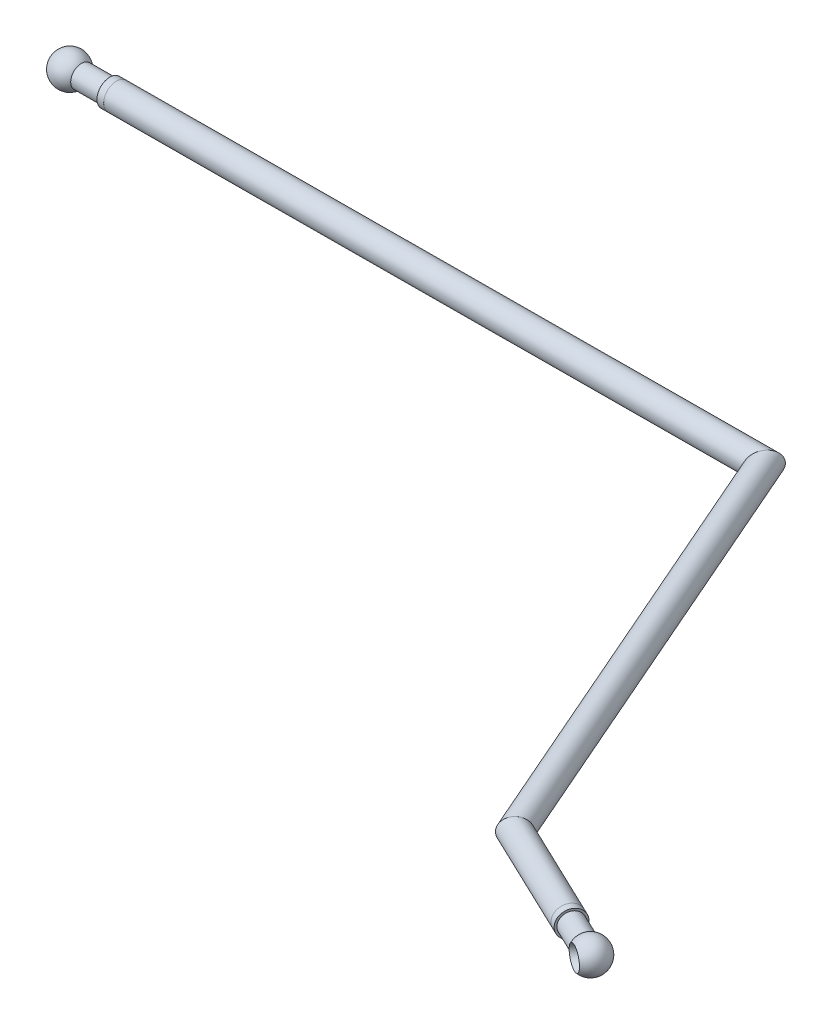
ISO-10303-21;
HEADER;
FILE_DESCRIPTION(('STEP AP214'),'2;1');
FILE_NAME('part.step','',(''),(''),'','','');
FILE_SCHEMA(('AUTOMOTIVE_DESIGN { 1 0 10303 214 1 1 1 1 }'));
ENDSEC;
DATA;
#1=APPLICATION_CONTEXT('core data for automotive mechanical design processes');
#2=APPLICATION_PROTOCOL_DEFINITION('international standard','automotive_design',2000,#1);
#3=PRODUCT_CONTEXT('',#1,'mechanical');
#4=PRODUCT('Part','Part','',(#3));
#5=PRODUCT_RELATED_PRODUCT_CATEGORY('part','',(#4));
#6=PRODUCT_DEFINITION_FORMATION('','',#4);
#7=PRODUCT_DEFINITION_CONTEXT('part definition',#1,'design');
#8=PRODUCT_DEFINITION('design','',#6,#7);
#9=PRODUCT_DEFINITION_SHAPE('','',#8);
#10=(LENGTH_UNIT() NAMED_UNIT(*) SI_UNIT(.MILLI.,.METRE.));
#11=(NAMED_UNIT(*) PLANE_ANGLE_UNIT() SI_UNIT($,.RADIAN.));
#12=(NAMED_UNIT(*) SI_UNIT($,.STERADIAN.) SOLID_ANGLE_UNIT());
#13=UNCERTAINTY_MEASURE_WITH_UNIT(LENGTH_MEASURE(1.E-05),#10,'distance_accuracy_value','');
#14=(GEOMETRIC_REPRESENTATION_CONTEXT(3) GLOBAL_UNCERTAINTY_ASSIGNED_CONTEXT((#13)) GLOBAL_UNIT_ASSIGNED_CONTEXT((#10,
#11,#12)) REPRESENTATION_CONTEXT('',''));
#15=CARTESIAN_POINT('',(0.,0.,0.));
#16=DIRECTION('',(0.,0.,1.));
#17=DIRECTION('',(1.,0.,0.));
#18=AXIS2_PLACEMENT_3D('',#15,#16,#17);
#19=CARTESIAN_POINT('',(739.449138930112,-90.6680158674377,336.150106034467));
#20=DIRECTION('',(-0.897622045646868,-0.0222671955812552,-0.440203174874602));
#21=DIRECTION('',(-0.440312348004288,0.,0.897844661506071));
#22=AXIS2_PLACEMENT_3D('',#19,#20,#21);
#23=CYLINDRICAL_SURFACE('',#22,9.50000000000001);
#24=CARTESIAN_POINT('',(739.449138930112,-90.6680158674377,336.150106034467));
#25=DIRECTION('',(0.897622045646868,0.0222671955812552,0.440203174874602));
#26=DIRECTION('',(-0.024799243118086,0.999692451477338,0.));
#27=AXIS2_PLACEMENT_3D('',#24,#25,#26);
#28=CIRCLE('',#27,9.50000000000001);
#29=CARTESIAN_POINT('',(739.21354612049,-81.170937578403,336.150106034467));
#30=VERTEX_POINT('',#29);
#31=EDGE_CURVE('E69',#30,#30,#28,.T.);
#32=ORIENTED_EDGE('',*,*,#31,.F.);
#33=EDGE_LOOP('',(#32));
#34=FACE_BOUND('',#33,.T.);
#35=CARTESIAN_POINT('',(734.961028701877,-90.779351845344,333.949090160094));
#36=DIRECTION('',(0.897622045646868,0.0222671955812552,0.440203174874602));
#37=DIRECTION('',(-0.024799243118086,0.999692451477338,0.));
#38=AXIS2_PLACEMENT_3D('',#35,#36,#37);
#39=CIRCLE('',#38,9.50000000000001);
#40=CARTESIAN_POINT('',(734.725435892256,-81.2822735563093,333.949090160094));
#41=VERTEX_POINT('',#40);
#42=EDGE_CURVE('E68',#41,#41,#39,.T.);
#43=ORIENTED_EDGE('',*,*,#42,.T.);
#44=EDGE_LOOP('',(#43));
#45=FACE_BOUND('',#44,.T.);
#46=ADVANCED_FACE('F64',(#34,#45),#23,.T.);
#47=CARTESIAN_POINT('',(739.449138930112,-90.6680158674377,336.150106034467));
#48=DIRECTION('',(0.897622045646868,0.0222671955812552,0.440203174874602));
#49=DIRECTION('',(0.440312348004288,0.,-0.897844661506071));
#50=AXIS2_PLACEMENT_3D('',#47,#48,#49);
#51=PLANE('',#50);
#52=CARTESIAN_POINT('',(739.449138930112,-90.6680158674378,336.150106034467));
#53=DIRECTION('',(0.897622045646868,0.0222671955812553,0.440203174874602));
#54=DIRECTION('',(0.440312348004288,0.,-0.897844661506071));
#55=AXIS2_PLACEMENT_3D('',#52,#53,#54);
#56=CIRCLE('',#55,7.99999999999998);
#57=CARTESIAN_POINT('',(742.971637714146,-90.6680158674378,328.967348742418));
#58=VERTEX_POINT('',#57);
#59=EDGE_CURVE('E12',#58,#58,#56,.T.);
#60=ORIENTED_EDGE('',*,*,#59,.F.);
#61=EDGE_LOOP('',(#60));
#62=FACE_BOUND('',#61,.T.);
#63=ORIENTED_EDGE('',*,*,#31,.T.);
#64=EDGE_LOOP('',(#63));
#65=FACE_BOUND('',#64,.T.);
#66=ADVANCED_FACE('F100',(#62,#65),#51,.T.);
#67=CARTESIAN_POINT('',(734.961028701877,-90.779351845344,333.949090160094));
#68=DIRECTION('',(0.897622045646868,0.0222671955812552,0.440203174874602));
#69=DIRECTION('',(0.440312348004288,0.,-0.897844661506071));
#70=AXIS2_PLACEMENT_3D('',#67,#68,#69);
#71=PLANE('',#70);
#72=ORIENTED_EDGE('',*,*,#42,.F.);
#73=EDGE_LOOP('',(#72));
#74=FACE_BOUND('',#73,.T.);
#75=ADVANCED_FACE('F103',(#74),#71,.F.);
#76=CARTESIAN_POINT('',(781.029208390176,-89.6365443885012,356.541403993995));
#77=DIRECTION('',(-0.897622045646868,-0.0222671955812553,-0.440203174874601));
#78=DIRECTION('',(-0.440312348004288,0.,0.897844661506071));
#79=AXIS2_PLACEMENT_3D('',#76,#77,#78);
#80=CYLINDRICAL_SURFACE('',#79,7.99999999999998);
#81=ORIENTED_EDGE('',*,*,#59,.T.);
#82=EDGE_LOOP('',(#81));
#83=FACE_BOUND('',#82,.T.);
#84=CARTESIAN_POINT('',(758.349224650852,-90.1991638519518,345.418904388986));
#85=DIRECTION('',(0.897622045646867,0.0222671955812557,0.440203174874599));
#86=DIRECTION('',(0.440312348004286,0.,-0.897844661506071));
#87=AXIS2_PLACEMENT_3D('',#84,#85,#86);
#88=CIRCLE('',#87,7.99999999999998);
#89=CARTESIAN_POINT('',(761.871723434887,-90.1991638519518,338.236147096938));
#90=VERTEX_POINT('',#89);
#91=EDGE_CURVE('E76',#90,#90,#88,.T.);
#92=ORIENTED_EDGE('',*,*,#91,.F.);
#93=EDGE_LOOP('',(#92));
#94=FACE_BOUND('',#93,.T.);
#95=ADVANCED_FACE('F115',(#83,#94),#80,.T.);
#96=CARTESIAN_POINT('',(766.377800299518,-90.0000000000003,349.356201280705));
#97=DIRECTION('',(0.440312348004288,0.,-0.897844661506071));
#98=DIRECTION('',(0.897844661506071,0.,0.440312348004288));
#99=AXIS2_PLACEMENT_3D('',#96,#97,#98);
#100=SPHERICAL_SURFACE('',#99,11.9999999999917);
#101=CARTESIAN_POINT('',(762.516674572281,-90.0000000000003,357.229455658685));
#102=DIRECTION('',(0.440312348004288,0.,-0.897844661506071));
#103=DIRECTION('',(-0.897844661506071,0.,-0.440312348004288));
#104=AXIS2_PLACEMENT_3D('',#101,#102,#103);
#105=CIRCLE('',#104,8.19167709432452);
#106=CARTESIAN_POINT('',(755.16182102436,-90.0000000000003,353.62255908319));
#107=VERTEX_POINT('',#106);
#108=EDGE_CURVE('E78',#107,#107,#105,.T.);
#109=ORIENTED_EDGE('',*,*,#108,.T.);
#110=EDGE_LOOP('',(#109));
#111=FACE_BOUND('',#110,.T.);
#112=ORIENTED_EDGE('',*,*,#91,.T.);
#113=EDGE_LOOP('',(#112));
#114=FACE_BOUND('',#113,.T.);
#115=ADVANCED_FACE('F92',(#111,#114),#100,.T.);
#116=CARTESIAN_POINT('',(764.938427865156,-90.0000000000003,352.291237879084));
#117=DIRECTION('',(-0.440312348004288,0.,0.897844661506071));
#118=DIRECTION('',(0.897844661506071,0.,0.440312348004288));
#119=AXIS2_PLACEMENT_3D('',#116,#117,#118);
#120=CONICAL_SURFACE('',#119,6.18981156105512,0.349065850398861);
#121=ORIENTED_EDGE('',*,*,#108,.F.);
#122=EDGE_LOOP('',(#121));
#123=FACE_BOUND('',#122,.T.);
#124=CARTESIAN_POINT('',(764.938427865156,-90.0000000000003,352.291237879084));
#125=DIRECTION('',(0.440312348004288,0.,-0.897844661506071));
#126=DIRECTION('',(-0.897844661506071,0.,-0.440312348004288));
#127=AXIS2_PLACEMENT_3D('',#124,#125,#126);
#128=CIRCLE('',#127,6.18981156105509);
#129=CARTESIAN_POINT('',(759.380938599334,-90.0000000000003,349.565787416931));
#130=VERTEX_POINT('',#129);
#131=EDGE_CURVE('E85',#130,#130,#128,.T.);
#132=ORIENTED_EDGE('',*,*,#131,.T.);
#133=EDGE_LOOP('',(#132));
#134=FACE_BOUND('',#133,.T.);
#135=ADVANCED_FACE('F87',(#123,#134),#120,.F.);
#136=CARTESIAN_POINT('',(766.377800299518,-90.0000000000003,349.356201280705));
#137=DIRECTION('',(0.440312348004288,0.,-0.897844661506071));
#138=DIRECTION('',(0.897844661506071,0.,0.440312348004288));
#139=AXIS2_PLACEMENT_3D('',#136,#137,#138);
#140=SPHERICAL_SURFACE('',#139,6.99999999999983);
#141=ORIENTED_EDGE('',*,*,#131,.F.);
#142=EDGE_LOOP('',(#141));
#143=FACE_BOUND('',#142,.T.);
#144=ADVANCED_FACE('F89',(#143),#140,.F.);
#145=CLOSED_SHELL('',(#46,#66,#75,#95,#115,#135,#144));
#146=MANIFOLD_SOLID_BREP('B2',#145);
#147=CARTESIAN_POINT('',(0.461014548223053,-109.,-37.9972033916488));
#148=DIRECTION('',(-0.0194973858732927,0.,0.999809907904552));
#149=DIRECTION('',(0.999809907904552,0.,0.0194973858732927));
#150=AXIS2_PLACEMENT_3D('',#147,#148,#149);
#151=SPHERICAL_SURFACE('',#150,11.9999999999998);
#152=CARTESIAN_POINT('',(0.631975387267541,-109.,-46.7639345755706));
#153=DIRECTION('',(-0.0194973858732927,0.,0.999809907904552));
#154=DIRECTION('',(0.999809907904552,0.,0.0194973858732927));
#155=AXIS2_PLACEMENT_3D('',#152,#153,#154);
#156=CIRCLE('',#155,8.19238651067936);
#157=CARTESIAN_POINT('',(8.82280459002836,-109.,-46.6042044545488));
#158=VERTEX_POINT('',#157);
#159=EDGE_CURVE('E179',#158,#158,#156,.T.);
#160=ORIENTED_EDGE('',*,*,#159,.T.);
#161=EDGE_LOOP('',(#160));
#162=FACE_BOUND('',#161,.T.);
#163=CARTESIAN_POINT('',(9.40083699315448,-108.778230965017,-37.8228670838472));
#164=DIRECTION('',(-0.999502534682283,-0.0247945318763777,-0.0194913917595375));
#165=DIRECTION('',(0.0247992431180859,-0.999692451477338,0.));
#166=AXIS2_PLACEMENT_3D('',#163,#164,#165);
#167=CIRCLE('',#166,8.);
#168=CARTESIAN_POINT('',(9.59923093809916,-116.775770576835,-37.8228670838472));
#169=VERTEX_POINT('',#168);
#170=EDGE_CURVE('E65',#169,#169,#167,.F.);
#171=ORIENTED_EDGE('',*,*,#170,.F.);
#172=EDGE_LOOP('',(#171));
#173=FACE_BOUND('',#172,.T.);
#174=ADVANCED_FACE('F171',(#162,#173),#151,.T.);
#175=CARTESIAN_POINT('',(0.524730340877128,-109.,-41.2644968226515));
#176=DIRECTION('',(0.0194973858732927,0.,-0.999809907904552));
#177=DIRECTION('',(-0.999809907904552,0.,-0.0194973858732927));
#178=AXIS2_PLACEMENT_3D('',#175,#176,#177);
#179=CONICAL_SURFACE('',#178,6.19037429672013,0.349065850398864);
#180=ORIENTED_EDGE('',*,*,#159,.F.);
#181=EDGE_LOOP('',(#180));
#182=FACE_BOUND('',#181,.T.);
#183=CARTESIAN_POINT('',(0.524730340877128,-109.,-41.2644968226515));
#184=DIRECTION('',(-0.0194973858732927,0.,0.999809907904552));
#185=DIRECTION('',(0.999809907904552,0.,0.0194973858732927));
#186=AXIS2_PLACEMENT_3D('',#183,#184,#185);
#187=CIRCLE('',#186,6.19037429672013);
#188=CARTESIAN_POINT('',(6.71392789637558,-109.,-41.1438007062882));
#189=VERTEX_POINT('',#188);
#190=EDGE_CURVE('E182',#189,#189,#187,.T.);
#191=ORIENTED_EDGE('',*,*,#190,.T.);
#192=EDGE_LOOP('',(#191));
#193=FACE_BOUND('',#192,.T.);
#194=ADVANCED_FACE('F218',(#182,#193),#179,.F.);
#195=CARTESIAN_POINT('',(0.461014548223053,-109.,-37.9972033916488));
#196=DIRECTION('',(-0.0194973858732927,0.,0.999809907904552));
#197=DIRECTION('',(-0.999809907904552,0.,-0.0194973858732927));
#198=AXIS2_PLACEMENT_3D('',#195,#196,#197);
#199=SPHERICAL_SURFACE('',#198,7.);
#200=ORIENTED_EDGE('',*,*,#190,.F.);
#201=EDGE_LOOP('',(#200));
#202=FACE_BOUND('',#201,.T.);
#203=ADVANCED_FACE('F221',(#202),#199,.F.);
#204=CARTESIAN_POINT('',(-12.0592592381203,-109.31058883467,-38.2413624136005));
#205=DIRECTION('',(0.999502534682283,0.0247945318763778,0.0194913917595376));
#206=DIRECTION('',(-0.0247992431180861,0.999692451477338,0.));
#207=AXIS2_PLACEMENT_3D('',#204,#205,#206);
#208=CYLINDRICAL_SURFACE('',#207,8.);
#209=CARTESIAN_POINT('',(30.4460905886916,-108.256164043709,-37.4124616388627));
#210=DIRECTION('',(-0.999502534682283,-0.0247945318763778,-0.0194913917595376));
#211=DIRECTION('',(0.0247992431180861,-0.999692451477338,0.));
#212=AXIS2_PLACEMENT_3D('',#209,#210,#211);
#213=CIRCLE('',#212,8.);
#214=CARTESIAN_POINT('',(30.6444845336362,-116.253703655527,-37.4124616388627));
#215=VERTEX_POINT('',#214);
#216=EDGE_CURVE('E188',#215,#215,#213,.T.);
#217=ORIENTED_EDGE('',*,*,#216,.T.);
#218=EDGE_LOOP('',(#217));
#219=FACE_BOUND('',#218,.T.);
#220=ORIENTED_EDGE('',*,*,#170,.T.);
#221=EDGE_LOOP('',(#220));
#222=FACE_BOUND('',#221,.T.);
#223=ADVANCED_FACE('F202',(#219,#222),#208,.T.);
#224=CARTESIAN_POINT('',(30.4460905886915,-108.256164043709,-37.4124616388627));
#225=DIRECTION('',(0.999502534682283,0.0247945318763778,0.0194913917595376));
#226=DIRECTION('',(-0.024799243118086,0.999692451477338,0.));
#227=AXIS2_PLACEMENT_3D('',#224,#225,#226);
#228=CYLINDRICAL_SURFACE('',#227,9.50000000000001);
#229=CARTESIAN_POINT('',(30.4460905886915,-108.256164043709,-37.4124616388627));
#230=DIRECTION('',(-0.999502534682283,-0.0247945318763778,-0.0194913917595376));
#231=DIRECTION('',(-0.024799243118086,0.999692451477338,0.));
#232=AXIS2_PLACEMENT_3D('',#229,#230,#231);
#233=CIRCLE('',#232,9.50000000000001);
#234=CARTESIAN_POINT('',(30.2104977790697,-98.759085754674,-37.4124616388627));
#235=VERTEX_POINT('',#234);
#236=EDGE_CURVE('E191',#235,#235,#233,.T.);
#237=ORIENTED_EDGE('',*,*,#236,.F.);
#238=EDGE_LOOP('',(#237));
#239=FACE_BOUND('',#238,.T.);
#240=CARTESIAN_POINT('',(35.443603262103,-108.132191384327,-37.315004680065));
#241=DIRECTION('',(-0.999502534682283,-0.0247945318763778,-0.0194913917595376));
#242=DIRECTION('',(-0.024799243118086,0.999692451477338,0.));
#243=AXIS2_PLACEMENT_3D('',#240,#241,#242);
#244=CIRCLE('',#243,9.50000000000001);
#245=CARTESIAN_POINT('',(35.2080104524811,-98.6351130952921,-37.315004680065));
#246=VERTEX_POINT('',#245);
#247=EDGE_CURVE('E195',#246,#246,#244,.T.);
#248=ORIENTED_EDGE('',*,*,#247,.T.);
#249=EDGE_LOOP('',(#248));
#250=FACE_BOUND('',#249,.T.);
#251=ADVANCED_FACE('F199',(#239,#250),#228,.T.);
#252=CARTESIAN_POINT('',(30.4460905886915,-108.256164043709,-37.4124616388627));
#253=DIRECTION('',(-0.999502534682283,-0.0247945318763778,-0.0194913917595376));
#254=DIRECTION('',(0.024799243118086,-0.999692451477338,0.));
#255=AXIS2_PLACEMENT_3D('',#252,#253,#254);
#256=PLANE('',#255);
#257=ORIENTED_EDGE('',*,*,#216,.F.);
#258=EDGE_LOOP('',(#257));
#259=FACE_BOUND('',#258,.T.);
#260=ORIENTED_EDGE('',*,*,#236,.T.);
#261=EDGE_LOOP('',(#260));
#262=FACE_BOUND('',#261,.T.);
#263=ADVANCED_FACE('F198',(#259,#262),#256,.T.);
#264=CARTESIAN_POINT('',(35.443603262103,-108.132191384327,-37.315004680065));
#265=DIRECTION('',(-0.999502534682283,-0.0247945318763778,-0.0194913917595376));
#266=DIRECTION('',(0.024799243118086,-0.999692451477338,0.));
#267=AXIS2_PLACEMENT_3D('',#264,#265,#266);
#268=PLANE('',#267);
#269=ORIENTED_EDGE('',*,*,#247,.F.);
#270=EDGE_LOOP('',(#269));
#271=FACE_BOUND('',#270,.T.);
#272=ADVANCED_FACE('F210',(#271),#268,.F.);
#273=CLOSED_SHELL('',(#174,#194,#203,#223,#251,#263,#272));
#274=MANIFOLD_SOLID_BREP('B7',#273);
#275=CARTESIAN_POINT('',(515.204819909599,-96.2308160836655,-27.959136635487));
#276=DIRECTION('',(-0.999502534682283,-0.0247945318763778,-0.0194913917595376));
#277=DIRECTION('',(0.0247992431180861,-0.999692451477338,0.));
#278=AXIS2_PLACEMENT_3D('',#275,#276,#277);
#279=CYLINDRICAL_SURFACE('',#278,8.5);
#280=CARTESIAN_POINT('',(35.443603262103,-108.132191384327,-37.315004680065));
#281=DIRECTION('',(0.999502534682283,0.0247945318763778,0.0194913917595376));
#282=DIRECTION('',(-0.024799243118086,0.999692451477338,0.));
#283=AXIS2_PLACEMENT_3D('',#280,#281,#282);
#284=CIRCLE('',#283,8.5);
#285=CARTESIAN_POINT('',(35.2328096955992,-99.6348055467694,-37.315004680065));
#286=VERTEX_POINT('',#285);
#287=EDGE_CURVE('E286',#286,#286,#284,.T.);
#288=ORIENTED_EDGE('',*,*,#287,.F.);
#289=EDGE_LOOP('',(#288));
#290=FACE_BOUND('',#289,.T.);
#291=CARTESIAN_POINT('',(515.204819909599,-96.2308160836655,-27.959136635487));
#292=DIRECTION('',(0.83250239152949,0.0206517806285505,0.553636407811616));
#293=DIRECTION('',(-0.553466137752302,-0.0137297638763441,0.832758505177491));
#294=AXIS2_PLACEMENT_3D('',#291,#292,#293);
#295=ELLIPSE('',#294,10.0783569031904,8.5);
#296=CARTESIAN_POINT('',(509.626790639501,-96.3691895442078,-19.5662992061409));
#297=VERTEX_POINT('',#296);
#298=EDGE_CURVE('E283',#297,#297,#295,.T.);
#299=ORIENTED_EDGE('',*,*,#298,.T.);
#300=EDGE_LOOP('',(#299));
#301=FACE_BOUND('',#300,.T.);
#302=ADVANCED_FACE('F282',(#290,#301),#279,.F.);
#303=CARTESIAN_POINT('',(515.204819909599,-96.2308160836655,-27.959136635487));
#304=DIRECTION('',(-0.999502534682283,-0.0247945318763778,-0.0194913917595376));
#305=DIRECTION('',(0.0247992431180861,-0.999692451477338,0.));
#306=AXIS2_PLACEMENT_3D('',#303,#304,#305);
#307=CYLINDRICAL_SURFACE('',#306,9.50000000000001);
#308=CARTESIAN_POINT('',(35.443603262103,-108.132191384327,-37.315004680065));
#309=DIRECTION('',(0.999502534682283,0.0247945318763778,0.0194913917595376));
#310=DIRECTION('',(-0.024799243118086,0.999692451477338,0.));
#311=AXIS2_PLACEMENT_3D('',#308,#309,#310);
#312=CIRCLE('',#311,9.50000000000001);
#313=CARTESIAN_POINT('',(35.2080104524811,-98.6351130952921,-37.315004680065));
#314=VERTEX_POINT('',#313);
#315=EDGE_CURVE('E291',#314,#314,#312,.T.);
#316=ORIENTED_EDGE('',*,*,#315,.T.);
#317=EDGE_LOOP('',(#316));
#318=FACE_BOUND('',#317,.T.);
#319=CARTESIAN_POINT('',(515.204819909599,-96.2308160836655,-27.959136635487));
#320=DIRECTION('',(0.83250239152949,0.0206517806285505,0.553636407811616));
#321=DIRECTION('',(-0.553466137752302,-0.0137297638763441,0.832758505177491));
#322=AXIS2_PLACEMENT_3D('',#319,#320,#321);
#323=ELLIPSE('',#322,11.2640459506245,9.50000000000001);
#324=CARTESIAN_POINT('',(508.970551901842,-96.3854687748598,-18.5789065673943));
#325=VERTEX_POINT('',#324);
#326=EDGE_CURVE('E174',#325,#325,#323,.T.);
#327=ORIENTED_EDGE('',*,*,#326,.F.);
#328=EDGE_LOOP('',(#327));
#329=FACE_BOUND('',#328,.T.);
#330=ADVANCED_FACE('F306',(#318,#329),#307,.T.);
#331=CARTESIAN_POINT('',(35.443603262103,-108.132191384327,-37.315004680065));
#332=DIRECTION('',(0.999502534682283,0.0247945318763778,0.0194913917595376));
#333=DIRECTION('',(-0.024799243118086,0.999692451477338,0.));
#334=AXIS2_PLACEMENT_3D('',#331,#332,#333);
#335=PLANE('',#334);
#336=ORIENTED_EDGE('',*,*,#287,.T.);
#337=EDGE_LOOP('',(#336));
#338=FACE_BOUND('',#337,.T.);
#339=ORIENTED_EDGE('',*,*,#315,.F.);
#340=EDGE_LOOP('',(#339));
#341=FACE_BOUND('',#340,.T.);
#342=ADVANCED_FACE('F303',(#338,#341),#335,.F.);
#343=CARTESIAN_POINT('',(515.204819909599,-96.2308160836654,-27.9591366354869));
#344=DIRECTION('',(0.83250239152949,0.0206517806285505,0.553636407811616));
#345=DIRECTION('',(0.553754507458365,0.,-0.83267997782434));
#346=AXIS2_PLACEMENT_3D('',#343,#344,#345);
#347=PLANE('',#346);
#348=ORIENTED_EDGE('',*,*,#298,.F.);
#349=EDGE_LOOP('',(#348));
#350=FACE_BOUND('',#349,.T.);
#351=ORIENTED_EDGE('',*,*,#326,.T.);
#352=EDGE_LOOP('',(#351));
#353=FACE_BOUND('',#352,.T.);
#354=ADVANCED_FACE('F284',(#350,#353),#347,.T.);
#355=CLOSED_SHELL('',(#302,#330,#342,#354));
#356=MANIFOLD_SOLID_BREP('B60',#355);
#357=CARTESIAN_POINT('',(658.890450998054,-92.6664249625037,296.64328870149));
#358=DIRECTION('',(-0.404748256587199,-0.0100405383694697,-0.914373029118244));
#359=DIRECTION('',(-0.914419122678071,0.,0.404768659953643));
#360=AXIS2_PLACEMENT_3D('',#357,#358,#359);
#361=CYLINDRICAL_SURFACE('',#360,8.5);
#362=CARTESIAN_POINT('',(658.890450998054,-92.6664249625037,296.64328870149));
#363=DIRECTION('',(0.692976763585115,0.0171905861747134,0.720754943706992));
#364=DIRECTION('',(0.720533276588854,0.0178741770775521,-0.693189953131125));
#365=AXIS2_PLACEMENT_3D('',#362,#363,#364);
#366=ELLIPSE('',#365,9.04551106604526,8.5);
#367=CARTESIAN_POINT('',(665.408042724893,-92.5047438959523,290.373031309571));
#368=VERTEX_POINT('',#367);
#369=EDGE_CURVE('E392',#368,#368,#366,.T.);
#370=ORIENTED_EDGE('',*,*,#369,.T.);
#371=EDGE_LOOP('',(#370));
#372=FACE_BOUND('',#371,.T.);
#373=CARTESIAN_POINT('',(515.204819909599,-96.2308160836655,-27.9591366354869));
#374=DIRECTION('',(-0.83250239152949,-0.0206517806285505,-0.553636407811616));
#375=DIRECTION('',(0.553466137752302,0.0137297638763441,-0.832758505177491));
#376=AXIS2_PLACEMENT_3D('',#373,#374,#375);
#377=ELLIPSE('',#376,10.0783569031904,8.5);
#378=CARTESIAN_POINT('',(520.782849179697,-96.0924426231231,-36.351974064833));
#379=VERTEX_POINT('',#378);
#380=EDGE_CURVE('E384',#379,#379,#377,.T.);
#381=ORIENTED_EDGE('',*,*,#380,.T.);
#382=EDGE_LOOP('',(#381));
#383=FACE_BOUND('',#382,.T.);
#384=ADVANCED_FACE('F380',(#372,#383),#361,.F.);
#385=CARTESIAN_POINT('',(658.890450998054,-92.6664249625037,296.64328870149));
#386=DIRECTION('',(-0.404748256587199,-0.0100405383694697,-0.914373029118244));
#387=DIRECTION('',(-0.914419122678071,0.,0.404768659953643));
#388=AXIS2_PLACEMENT_3D('',#385,#386,#387);
#389=CYLINDRICAL_SURFACE('',#388,9.50000000000001);
#390=CARTESIAN_POINT('',(658.890450998054,-92.6664249625037,296.64328870149));
#391=DIRECTION('',(0.692976763585115,0.0171905861747134,0.720754943706992));
#392=DIRECTION('',(0.720533276588854,0.0178741770775521,-0.693189953131125));
#393=AXIS2_PLACEMENT_3D('',#390,#391,#392);
#394=ELLIPSE('',#393,10.1096888385212,9.50000000000001);
#395=CARTESIAN_POINT('',(666.174818222168,-92.4857225940051,289.635353969345));
#396=VERTEX_POINT('',#395);
#397=EDGE_CURVE('E389',#396,#396,#394,.T.);
#398=ORIENTED_EDGE('',*,*,#397,.F.);
#399=EDGE_LOOP('',(#398));
#400=FACE_BOUND('',#399,.T.);
#401=CARTESIAN_POINT('',(515.204819909599,-96.2308160836655,-27.9591366354869));
#402=DIRECTION('',(-0.83250239152949,-0.0206517806285505,-0.553636407811616));
#403=DIRECTION('',(0.553466137752302,0.0137297638763441,-0.832758505177491));
#404=AXIS2_PLACEMENT_3D('',#401,#402,#403);
#405=ELLIPSE('',#404,11.2640459506245,9.50000000000001);
#406=CARTESIAN_POINT('',(521.439087917355,-96.0761633924711,-37.3393667035796));
#407=VERTEX_POINT('',#406);
#408=EDGE_CURVE('E279',#407,#407,#405,.T.);
#409=ORIENTED_EDGE('',*,*,#408,.F.);
#410=EDGE_LOOP('',(#409));
#411=FACE_BOUND('',#410,.T.);
#412=ADVANCED_FACE('F407',(#400,#411),#389,.T.);
#413=CARTESIAN_POINT('',(658.890450998054,-92.6664249625037,296.64328870149));
#414=DIRECTION('',(0.692976763585115,0.0171905861747134,0.720754943706992));
#415=DIRECTION('',(0.72086146471675,0.,-0.693079179233096));
#416=AXIS2_PLACEMENT_3D('',#413,#414,#415);
#417=PLANE('',#416);
#418=ORIENTED_EDGE('',*,*,#369,.F.);
#419=EDGE_LOOP('',(#418));
#420=FACE_BOUND('',#419,.T.);
#421=ORIENTED_EDGE('',*,*,#397,.T.);
#422=EDGE_LOOP('',(#421));
#423=FACE_BOUND('',#422,.T.);
#424=ADVANCED_FACE('F404',(#420,#423),#417,.T.);
#425=CARTESIAN_POINT('',(515.204819909599,-96.2308160836654,-27.9591366354869));
#426=DIRECTION('',(-0.83250239152949,-0.0206517806285505,-0.553636407811616));
#427=DIRECTION('',(-0.553754507458365,0.,0.83267997782434));
#428=AXIS2_PLACEMENT_3D('',#425,#426,#427);
#429=PLANE('',#428);
#430=ORIENTED_EDGE('',*,*,#380,.F.);
#431=EDGE_LOOP('',(#430));
#432=FACE_BOUND('',#431,.T.);
#433=ORIENTED_EDGE('',*,*,#408,.T.);
#434=EDGE_LOOP('',(#433));
#435=FACE_BOUND('',#434,.T.);
#436=ADVANCED_FACE('F385',(#432,#435),#429,.T.);
#437=CLOSED_SHELL('',(#384,#412,#424,#436));
#438=MANIFOLD_SOLID_BREP('B168',#437);
#439=CARTESIAN_POINT('',(734.961028701877,-90.779351845344,333.949090160094));
#440=DIRECTION('',(-0.897622045646868,-0.0222671955812552,-0.440203174874601));
#441=DIRECTION('',(-0.440312348004288,0.,0.897844661506071));
#442=AXIS2_PLACEMENT_3D('',#439,#440,#441);
#443=CYLINDRICAL_SURFACE('',#442,8.5);
#444=CARTESIAN_POINT('',(734.961028701877,-90.779351845344,333.949090160094));
#445=DIRECTION('',(0.897622045646868,0.0222671955812552,0.440203174874602));
#446=DIRECTION('',(-0.024799243118086,0.999692451477338,0.));
#447=AXIS2_PLACEMENT_3D('',#444,#445,#446);
#448=CIRCLE('',#447,8.5);
#449=CARTESIAN_POINT('',(734.750235135374,-82.2819660077866,333.949090160094));
#450=VERTEX_POINT('',#449);
#451=EDGE_CURVE('E489',#450,#450,#448,.T.);
#452=ORIENTED_EDGE('',*,*,#451,.T.);
#453=EDGE_LOOP('',(#452));
#454=FACE_BOUND('',#453,.T.);
#455=CARTESIAN_POINT('',(658.890450998054,-92.6664249625037,296.64328870149));
#456=DIRECTION('',(-0.692976763585115,-0.0171905861747134,-0.720754943706992));
#457=DIRECTION('',(-0.720533276588854,-0.0178741770775521,0.693189953131125));
#458=AXIS2_PLACEMENT_3D('',#455,#456,#457);
#459=ELLIPSE('',#458,9.04551106604526,8.5);
#460=CARTESIAN_POINT('',(652.372859271216,-92.8281060290552,302.913546093409));
#461=VERTEX_POINT('',#460);
#462=EDGE_CURVE('E478',#461,#461,#459,.T.);
#463=ORIENTED_EDGE('',*,*,#462,.T.);
#464=EDGE_LOOP('',(#463));
#465=FACE_BOUND('',#464,.T.);
#466=ADVANCED_FACE('F472',(#454,#465),#443,.F.);
#467=CARTESIAN_POINT('',(734.961028701877,-90.779351845344,333.949090160094));
#468=DIRECTION('',(-0.897622045646868,-0.0222671955812552,-0.440203174874601));
#469=DIRECTION('',(-0.440312348004288,0.,0.897844661506071));
#470=AXIS2_PLACEMENT_3D('',#467,#468,#469);
#471=CYLINDRICAL_SURFACE('',#470,9.50000000000001);
#472=CARTESIAN_POINT('',(734.961028701877,-90.779351845344,333.949090160094));
#473=DIRECTION('',(0.897622045646868,0.0222671955812552,0.440203174874602));
#474=DIRECTION('',(-0.024799243118086,0.999692451477338,0.));
#475=AXIS2_PLACEMENT_3D('',#472,#473,#474);
#476=CIRCLE('',#475,9.50000000000001);
#477=CARTESIAN_POINT('',(734.725435892256,-81.2822735563093,333.949090160094));
#478=VERTEX_POINT('',#477);
#479=EDGE_CURVE('E481',#478,#478,#476,.T.);
#480=ORIENTED_EDGE('',*,*,#479,.F.);
#481=EDGE_LOOP('',(#480));
#482=FACE_BOUND('',#481,.T.);
#483=CARTESIAN_POINT('',(658.890450998054,-92.6664249625037,296.64328870149));
#484=DIRECTION('',(-0.692976763585115,-0.0171905861747134,-0.720754943706992));
#485=DIRECTION('',(-0.720533276588854,-0.0178741770775521,0.693189953131125));
#486=AXIS2_PLACEMENT_3D('',#483,#484,#485);
#487=ELLIPSE('',#486,10.1096888385212,9.50000000000001);
#488=CARTESIAN_POINT('',(651.606083773941,-92.8471273310024,303.651223433634));
#489=VERTEX_POINT('',#488);
#490=EDGE_CURVE('E378',#489,#489,#487,.T.);
#491=ORIENTED_EDGE('',*,*,#490,.F.);
#492=EDGE_LOOP('',(#491));
#493=FACE_BOUND('',#492,.T.);
#494=ADVANCED_FACE('F505',(#482,#493),#471,.T.);
#495=CARTESIAN_POINT('',(734.961028701877,-90.779351845344,333.949090160094));
#496=DIRECTION('',(0.897622045646868,0.0222671955812552,0.440203174874602));
#497=DIRECTION('',(-0.024799243118086,0.999692451477338,0.));
#498=AXIS2_PLACEMENT_3D('',#495,#496,#497);
#499=PLANE('',#498);
#500=ORIENTED_EDGE('',*,*,#451,.F.);
#501=EDGE_LOOP('',(#500));
#502=FACE_BOUND('',#501,.T.);
#503=ORIENTED_EDGE('',*,*,#479,.T.);
#504=EDGE_LOOP('',(#503));
#505=FACE_BOUND('',#504,.T.);
#506=ADVANCED_FACE('F498',(#502,#505),#499,.T.);
#507=CARTESIAN_POINT('',(658.890450998054,-92.6664249625037,296.64328870149));
#508=DIRECTION('',(-0.692976763585115,-0.0171905861747134,-0.720754943706992));
#509=DIRECTION('',(-0.72086146471675,0.,0.693079179233096));
#510=AXIS2_PLACEMENT_3D('',#507,#508,#509);
#511=PLANE('',#510);
#512=ORIENTED_EDGE('',*,*,#462,.F.);
#513=EDGE_LOOP('',(#512));
#514=FACE_BOUND('',#513,.T.);
#515=ORIENTED_EDGE('',*,*,#490,.T.);
#516=EDGE_LOOP('',(#515));
#517=FACE_BOUND('',#516,.T.);
#518=ADVANCED_FACE('F477',(#514,#517),#511,.T.);
#519=CLOSED_SHELL('',(#466,#494,#506,#518));
#520=MANIFOLD_SOLID_BREP('B274',#519);
#521=ADVANCED_BREP_SHAPE_REPRESENTATION('',(#18,#146,#274,#356,#438,#520),#14);
#522=SHAPE_DEFINITION_REPRESENTATION(#9,#521);
ENDSEC;
END-ISO-10303-21;
